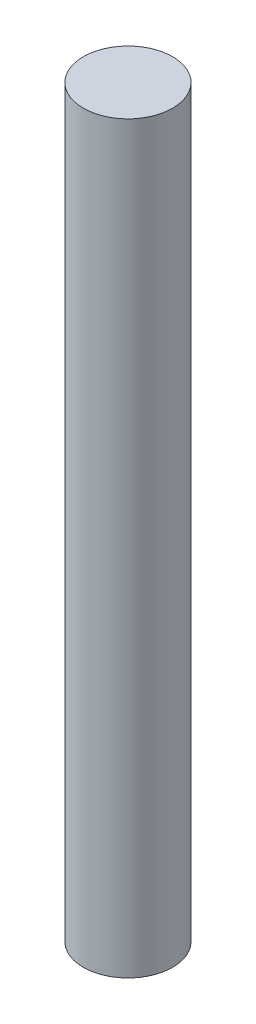
ISO-10303-21;
HEADER;
FILE_DESCRIPTION(('STEP AP214'),'2;1');
FILE_NAME('part.step','',(''),(''),'','','');
FILE_SCHEMA(('AUTOMOTIVE_DESIGN { 1 0 10303 214 1 1 1 1 }'));
ENDSEC;
DATA;
#1=APPLICATION_CONTEXT('core data for automotive mechanical design processes');
#2=APPLICATION_PROTOCOL_DEFINITION('international standard','automotive_design',2000,#1);
#3=PRODUCT_CONTEXT('',#1,'mechanical');
#4=PRODUCT('Part','Part','',(#3));
#5=PRODUCT_RELATED_PRODUCT_CATEGORY('part','',(#4));
#6=PRODUCT_DEFINITION_FORMATION('','',#4);
#7=PRODUCT_DEFINITION_CONTEXT('part definition',#1,'design');
#8=PRODUCT_DEFINITION('design','',#6,#7);
#9=PRODUCT_DEFINITION_SHAPE('','',#8);
#10=(LENGTH_UNIT() NAMED_UNIT(*) SI_UNIT(.MILLI.,.METRE.));
#11=(NAMED_UNIT(*) PLANE_ANGLE_UNIT() SI_UNIT($,.RADIAN.));
#12=(NAMED_UNIT(*) SI_UNIT($,.STERADIAN.) SOLID_ANGLE_UNIT());
#13=UNCERTAINTY_MEASURE_WITH_UNIT(LENGTH_MEASURE(1.E-05),#10,'distance_accuracy_value','');
#14=(GEOMETRIC_REPRESENTATION_CONTEXT(3) GLOBAL_UNCERTAINTY_ASSIGNED_CONTEXT((#13)) GLOBAL_UNIT_ASSIGNED_CONTEXT((#10,
#11,#12)) REPRESENTATION_CONTEXT('',''));
#15=CARTESIAN_POINT('',(0.,0.,0.));
#16=DIRECTION('',(0.,0.,1.));
#17=DIRECTION('',(1.,0.,0.));
#18=AXIS2_PLACEMENT_3D('',#15,#16,#17);
#19=CARTESIAN_POINT('',(0.,30.,0.));
#20=DIRECTION('',(0.,-1.,0.));
#21=DIRECTION('',(0.,0.,-1.));
#22=AXIS2_PLACEMENT_3D('',#19,#20,#21);
#23=CYLINDRICAL_SURFACE('',#22,1.8);
#24=CARTESIAN_POINT('',(0.,30.,0.));
#25=DIRECTION('',(0.,1.,0.));
#26=DIRECTION('',(0.,0.,1.));
#27=AXIS2_PLACEMENT_3D('',#24,#25,#26);
#28=CIRCLE('',#27,1.8);
#29=CARTESIAN_POINT('',(0.,30.,1.8));
#30=VERTEX_POINT('',#29);
#31=EDGE_CURVE('E10',#30,#30,#28,.T.);
#32=ORIENTED_EDGE('',*,*,#31,.F.);
#33=EDGE_LOOP('',(#32));
#34=FACE_BOUND('',#33,.T.);
#35=CARTESIAN_POINT('',(0.,0.,0.));
#36=DIRECTION('',(0.,1.,0.));
#37=DIRECTION('',(0.,0.,1.));
#38=AXIS2_PLACEMENT_3D('',#35,#36,#37);
#39=CIRCLE('',#38,1.8);
#40=CARTESIAN_POINT('',(0.,0.,1.8));
#41=VERTEX_POINT('',#40);
#42=EDGE_CURVE('E33',#41,#41,#39,.T.);
#43=ORIENTED_EDGE('',*,*,#42,.T.);
#44=EDGE_LOOP('',(#43));
#45=FACE_BOUND('',#44,.T.);
#46=ADVANCED_FACE('F30',(#34,#45),#23,.T.);
#47=CARTESIAN_POINT('',(0.,30.,0.));
#48=DIRECTION('',(0.,1.,0.));
#49=DIRECTION('',(0.,0.,1.));
#50=AXIS2_PLACEMENT_3D('',#47,#48,#49);
#51=PLANE('',#50);
#52=ORIENTED_EDGE('',*,*,#31,.T.);
#53=EDGE_LOOP('',(#52));
#54=FACE_BOUND('',#53,.T.);
#55=ADVANCED_FACE('F45',(#54),#51,.T.);
#56=CARTESIAN_POINT('',(0.,0.,0.));
#57=DIRECTION('',(0.,1.,0.));
#58=DIRECTION('',(0.,0.,1.));
#59=AXIS2_PLACEMENT_3D('',#56,#57,#58);
#60=PLANE('',#59);
#61=ORIENTED_EDGE('',*,*,#42,.F.);
#62=EDGE_LOOP('',(#61));
#63=FACE_BOUND('',#62,.T.);
#64=ADVANCED_FACE('F43',(#63),#60,.F.);
#65=CLOSED_SHELL('',(#46,#55,#64));
#66=MANIFOLD_SOLID_BREP('B2',#65);
#67=ADVANCED_BREP_SHAPE_REPRESENTATION('',(#18,#66),#14);
#68=SHAPE_DEFINITION_REPRESENTATION(#9,#67);
ENDSEC;
END-ISO-10303-21;
